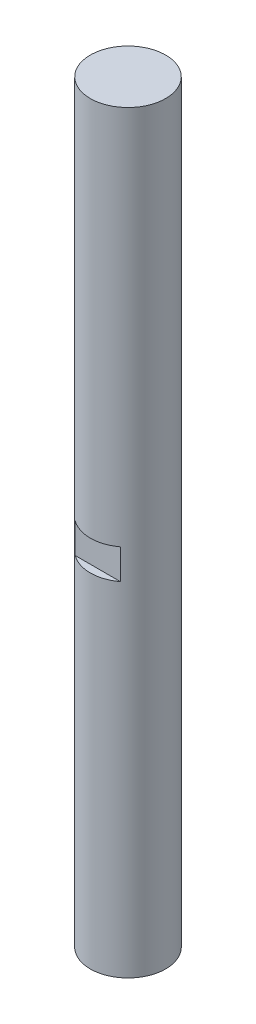
ISO-10303-21;
HEADER;
FILE_DESCRIPTION(('STEP AP214'),'2;1');
FILE_NAME('part.step','',(''),(''),'','','');
FILE_SCHEMA(('AUTOMOTIVE_DESIGN { 1 0 10303 214 1 1 1 1 }'));
ENDSEC;
DATA;
#1=APPLICATION_CONTEXT('core data for automotive mechanical design processes');
#2=APPLICATION_PROTOCOL_DEFINITION('international standard','automotive_design',2000,#1);
#3=PRODUCT_CONTEXT('',#1,'mechanical');
#4=PRODUCT('Part','Part','',(#3));
#5=PRODUCT_RELATED_PRODUCT_CATEGORY('part','',(#4));
#6=PRODUCT_DEFINITION_FORMATION('','',#4);
#7=PRODUCT_DEFINITION_CONTEXT('part definition',#1,'design');
#8=PRODUCT_DEFINITION('design','',#6,#7);
#9=PRODUCT_DEFINITION_SHAPE('','',#8);
#10=(LENGTH_UNIT() NAMED_UNIT(*) SI_UNIT(.MILLI.,.METRE.));
#11=(NAMED_UNIT(*) PLANE_ANGLE_UNIT() SI_UNIT($,.RADIAN.));
#12=(NAMED_UNIT(*) SI_UNIT($,.STERADIAN.) SOLID_ANGLE_UNIT());
#13=UNCERTAINTY_MEASURE_WITH_UNIT(LENGTH_MEASURE(1.E-05),#10,'distance_accuracy_value','');
#14=(GEOMETRIC_REPRESENTATION_CONTEXT(3) GLOBAL_UNCERTAINTY_ASSIGNED_CONTEXT((#13)) GLOBAL_UNIT_ASSIGNED_CONTEXT((#10,
#11,#12)) REPRESENTATION_CONTEXT('',''));
#15=CARTESIAN_POINT('',(0.,0.,0.));
#16=DIRECTION('',(0.,0.,1.));
#17=DIRECTION('',(1.,0.,0.));
#18=AXIS2_PLACEMENT_3D('',#15,#16,#17);
#19=CARTESIAN_POINT('',(0.,100.,0.));
#20=DIRECTION('',(0.,-1.,0.));
#21=DIRECTION('',(0.,0.,-1.));
#22=AXIS2_PLACEMENT_3D('',#19,#20,#21);
#23=CYLINDRICAL_SURFACE('',#22,5.);
#24=CARTESIAN_POINT('',(0.,0.,0.));
#25=DIRECTION('',(0.,1.,0.));
#26=DIRECTION('',(0.,0.,1.));
#27=AXIS2_PLACEMENT_3D('',#24,#25,#26);
#28=CIRCLE('',#27,5.);
#29=CARTESIAN_POINT('',(0.,0.,5.));
#30=VERTEX_POINT('',#29);
#31=EDGE_CURVE('E38',#30,#30,#28,.T.);
#32=ORIENTED_EDGE('',*,*,#31,.T.);
#33=EDGE_LOOP('',(#32));
#34=FACE_BOUND('',#33,.T.);
#35=CARTESIAN_POINT('',(0.,100.,0.));
#36=DIRECTION('',(0.,1.,0.));
#37=DIRECTION('',(0.,0.,1.));
#38=AXIS2_PLACEMENT_3D('',#35,#36,#37);
#39=CIRCLE('',#38,5.);
#40=CARTESIAN_POINT('',(0.,100.,5.));
#41=VERTEX_POINT('',#40);
#42=EDGE_CURVE('E11',#41,#41,#39,.T.);
#43=ORIENTED_EDGE('',*,*,#42,.F.);
#44=EDGE_LOOP('',(#43));
#45=FACE_BOUND('',#44,.T.);
#46=CARTESIAN_POINT('',(0.,49.5,0.));
#47=DIRECTION('',(0.,-1.,0.));
#48=DIRECTION('',(0.,0.,-1.));
#49=AXIS2_PLACEMENT_3D('',#46,#47,#48);
#50=CIRCLE('',#49,5.);
#51=CARTESIAN_POINT('',(3.,49.5,4.));
#52=VERTEX_POINT('',#51);
#53=CARTESIAN_POINT('',(-3.,49.5,4.));
#54=VERTEX_POINT('',#53);
#55=EDGE_CURVE('E69',#52,#54,#50,.T.);
#56=ORIENTED_EDGE('',*,*,#55,.F.);
#57=DIRECTION('',(0.,-1.,0.));
#58=VECTOR('',#57,1.);
#59=CARTESIAN_POINT('',(3.,49.5,4.));
#60=LINE('',#59,#58);
#61=CARTESIAN_POINT('',(3.,45.5,4.));
#62=VERTEX_POINT('',#61);
#63=EDGE_CURVE('E56',#52,#62,#60,.T.);
#64=ORIENTED_EDGE('',*,*,#63,.T.);
#65=CARTESIAN_POINT('',(0.,45.5,0.));
#66=DIRECTION('',(0.,-1.,0.));
#67=DIRECTION('',(0.,0.,-1.));
#68=AXIS2_PLACEMENT_3D('',#65,#66,#67);
#69=CIRCLE('',#68,5.);
#70=CARTESIAN_POINT('',(-3.,45.5,4.));
#71=VERTEX_POINT('',#70);
#72=EDGE_CURVE('E62',#62,#71,#69,.T.);
#73=ORIENTED_EDGE('',*,*,#72,.T.);
#74=DIRECTION('',(0.,-1.,0.));
#75=VECTOR('',#74,1.);
#76=CARTESIAN_POINT('',(-3.,49.5,4.));
#77=LINE('',#76,#75);
#78=EDGE_CURVE('E68',#54,#71,#77,.T.);
#79=ORIENTED_EDGE('',*,*,#78,.F.);
#80=EDGE_LOOP('',(#56,#64,#73,#79));
#81=FACE_BOUND('',#80,.T.);
#82=ADVANCED_FACE('F35',(#34,#45,#81),#23,.T.);
#83=CARTESIAN_POINT('',(0.,100.,0.));
#84=DIRECTION('',(0.,1.,0.));
#85=DIRECTION('',(0.,0.,1.));
#86=AXIS2_PLACEMENT_3D('',#83,#84,#85);
#87=PLANE('',#86);
#88=ORIENTED_EDGE('',*,*,#42,.T.);
#89=EDGE_LOOP('',(#88));
#90=FACE_BOUND('',#89,.T.);
#91=ADVANCED_FACE('F90',(#90),#87,.T.);
#92=CARTESIAN_POINT('',(0.,0.,0.));
#93=DIRECTION('',(0.,1.,0.));
#94=DIRECTION('',(0.,0.,1.));
#95=AXIS2_PLACEMENT_3D('',#92,#93,#94);
#96=PLANE('',#95);
#97=ORIENTED_EDGE('',*,*,#31,.F.);
#98=EDGE_LOOP('',(#97));
#99=FACE_BOUND('',#98,.T.);
#100=ADVANCED_FACE('F87',(#99),#96,.F.);
#101=CARTESIAN_POINT('',(-3.,49.5,4.));
#102=DIRECTION('',(0.,0.,-1.));
#103=DIRECTION('',(-1.,0.,0.));
#104=AXIS2_PLACEMENT_3D('',#101,#102,#103);
#105=PLANE('',#104);
#106=DIRECTION('',(1.,0.,0.));
#107=VECTOR('',#106,1.);
#108=CARTESIAN_POINT('',(-3.,45.5,4.));
#109=LINE('',#108,#107);
#110=EDGE_CURVE('E48',#71,#62,#109,.T.);
#111=ORIENTED_EDGE('',*,*,#110,.T.);
#112=ORIENTED_EDGE('',*,*,#63,.F.);
#113=DIRECTION('',(1.,0.,0.));
#114=VECTOR('',#113,1.);
#115=CARTESIAN_POINT('',(-3.,49.5,4.));
#116=LINE('',#115,#114);
#117=EDGE_CURVE('E74',#54,#52,#116,.T.);
#118=ORIENTED_EDGE('',*,*,#117,.F.);
#119=ORIENTED_EDGE('',*,*,#78,.T.);
#120=EDGE_LOOP('',(#111,#112,#118,#119));
#121=FACE_BOUND('',#120,.T.);
#122=ADVANCED_FACE('F67',(#121),#105,.F.);
#123=CARTESIAN_POINT('',(0.,49.5,0.));
#124=DIRECTION('',(0.,-1.,0.));
#125=DIRECTION('',(0.,0.,-1.));
#126=AXIS2_PLACEMENT_3D('',#123,#124,#125);
#127=PLANE('',#126);
#128=ORIENTED_EDGE('',*,*,#55,.T.);
#129=ORIENTED_EDGE('',*,*,#117,.T.);
#130=EDGE_LOOP('',(#128,#129));
#131=FACE_BOUND('',#130,.T.);
#132=ADVANCED_FACE('F79',(#131),#127,.T.);
#133=CARTESIAN_POINT('',(0.,45.5,0.));
#134=DIRECTION('',(0.,-1.,0.));
#135=DIRECTION('',(0.,0.,-1.));
#136=AXIS2_PLACEMENT_3D('',#133,#134,#135);
#137=PLANE('',#136);
#138=ORIENTED_EDGE('',*,*,#72,.F.);
#139=ORIENTED_EDGE('',*,*,#110,.F.);
#140=EDGE_LOOP('',(#138,#139));
#141=FACE_BOUND('',#140,.T.);
#142=ADVANCED_FACE('F63',(#141),#137,.F.);
#143=CLOSED_SHELL('',(#82,#91,#100,#122,#132,#142));
#144=MANIFOLD_SOLID_BREP('B2',#143);
#145=ADVANCED_BREP_SHAPE_REPRESENTATION('',(#18,#144),#14);
#146=SHAPE_DEFINITION_REPRESENTATION(#9,#145);
ENDSEC;
END-ISO-10303-21;
